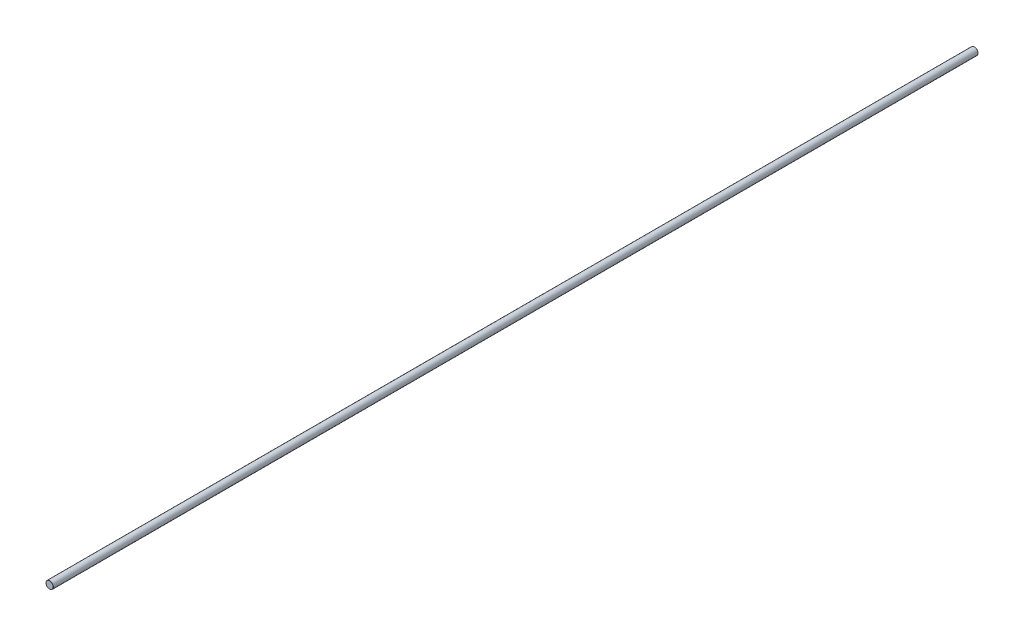
ISO-10303-21;
HEADER;
FILE_DESCRIPTION(('STEP AP214'),'2;1');
FILE_NAME('part.step','',(''),(''),'','','');
FILE_SCHEMA(('AUTOMOTIVE_DESIGN { 1 0 10303 214 1 1 1 1 }'));
ENDSEC;
DATA;
#1=APPLICATION_CONTEXT('core data for automotive mechanical design processes');
#2=APPLICATION_PROTOCOL_DEFINITION('international standard','automotive_design',2000,#1);
#3=PRODUCT_CONTEXT('',#1,'mechanical');
#4=PRODUCT('Part','Part','',(#3));
#5=PRODUCT_RELATED_PRODUCT_CATEGORY('part','',(#4));
#6=PRODUCT_DEFINITION_FORMATION('','',#4);
#7=PRODUCT_DEFINITION_CONTEXT('part definition',#1,'design');
#8=PRODUCT_DEFINITION('design','',#6,#7);
#9=PRODUCT_DEFINITION_SHAPE('','',#8);
#10=(LENGTH_UNIT() NAMED_UNIT(*) SI_UNIT(.MILLI.,.METRE.));
#11=(NAMED_UNIT(*) PLANE_ANGLE_UNIT() SI_UNIT($,.RADIAN.));
#12=(NAMED_UNIT(*) SI_UNIT($,.STERADIAN.) SOLID_ANGLE_UNIT());
#13=UNCERTAINTY_MEASURE_WITH_UNIT(LENGTH_MEASURE(1.E-05),#10,'distance_accuracy_value','');
#14=(GEOMETRIC_REPRESENTATION_CONTEXT(3) GLOBAL_UNCERTAINTY_ASSIGNED_CONTEXT((#13)) GLOBAL_UNIT_ASSIGNED_CONTEXT((#10,
#11,#12)) REPRESENTATION_CONTEXT('',''));
#15=CARTESIAN_POINT('',(0.,0.,0.));
#16=DIRECTION('',(0.,0.,1.));
#17=DIRECTION('',(1.,0.,0.));
#18=AXIS2_PLACEMENT_3D('',#15,#16,#17);
#19=CARTESIAN_POINT('',(0.,0.,750.));
#20=DIRECTION('',(0.,0.,-1.));
#21=DIRECTION('',(-1.,0.,0.));
#22=AXIS2_PLACEMENT_3D('',#19,#20,#21);
#23=CYLINDRICAL_SURFACE('',#22,6.);
#24=CARTESIAN_POINT('',(0.,-6.,0.0411462600315676));
#25=CARTESIAN_POINT('',(0.0023111743343624,-5.99999999809235,0.0411461575524475));
#26=CARTESIAN_POINT('',(0.00462402379593703,-5.9999986502803,0.0409508795649558));
#27=CARTESIAN_POINT('',(0.00918602363786496,-5.99999340315987,0.0401745878903154));
#28=CARTESIAN_POINT('',(0.0114350939780579,-5.99998950078168,0.039593110095375));
#29=CARTESIAN_POINT('',(0.015802783608805,-5.99997958659621,0.0380609747067094));
#30=CARTESIAN_POINT('',(0.0179214647265922,-5.99997357579789,0.037110493672024));
#31=CARTESIAN_POINT('',(0.0219685893059671,-5.99996012333506,0.0348675755401611));
#32=CARTESIAN_POINT('',(0.0238970798635291,-5.99995268202614,0.0335752233922364));
#33=CARTESIAN_POINT('',(0.0275099924272328,-5.999937205507,0.0306849647248258));
#34=CARTESIAN_POINT('',(0.0291943852810984,-5.99992917022602,0.0290870217617961));
#35=CARTESIAN_POINT('',(0.0322710559605854,-5.99991341205564,0.025630967888062));
#36=CARTESIAN_POINT('',(0.033663322306052,-5.99990568917853,0.0237728467575097));
#37=CARTESIAN_POINT('',(0.0361161286221365,-5.99989142694923,0.0198492472603494));
#38=CARTESIAN_POINT('',(0.0371766715052503,-5.99988488758665,0.0177837707145097));
#39=CARTESIAN_POINT('',(0.0389359363808815,-5.99987372960757,0.0135040828250582));
#40=CARTESIAN_POINT('',(0.0396346591387192,-5.99986911098701,0.0112898717960602));
#41=CARTESIAN_POINT('',(0.0406504429280133,-5.99986231527358,0.0067755992599893));
#42=CARTESIAN_POINT('',(0.040967509318674,-5.99986013814643,0.00447553895887625));
#43=CARTESIAN_POINT('',(0.0412109958074482,-5.99985847077535,-0.000145163273392342));
#44=CARTESIAN_POINT('',(0.041137416654171,-5.99985898052629,-0.00246580516509808));
#45=CARTESIAN_POINT('',(0.0406017073466908,-5.99986262939482,-0.00706175831748621));
#46=CARTESIAN_POINT('',(0.0401395835869672,-5.99986576846915,-0.00933707032355511));
#47=CARTESIAN_POINT('',(0.038839912623834,-5.99987432201555,-0.0137778174466584));
#48=CARTESIAN_POINT('',(0.0380023650015878,-5.99987973649015,-0.015943252441107));
#49=CARTESIAN_POINT('',(0.0359756145139185,-5.99989223044934,-0.0201027931831389));
#50=CARTESIAN_POINT('',(0.0347864087539367,-5.99989930994764,-0.0220968975202956));
#51=CARTESIAN_POINT('',(0.0320901026755382,-5.99991433578138,-0.0258571542101351));
#52=CARTESIAN_POINT('',(0.0305830024410953,-5.9999222821166,-0.0276233066230328));
#53=CARTESIAN_POINT('',(0.0272936520035431,-5.99993814594131,-0.0308775628460587));
#54=CARTESIAN_POINT('',(0.0255113960987836,-5.9999460634302,-0.0323656608930588));
#55=CARTESIAN_POINT('',(0.0217223471813882,-5.99996097677218,-0.03502152152381));
#56=CARTESIAN_POINT('',(0.0197155541391024,-5.99996797262514,-0.0361892840652609));
#57=CARTESIAN_POINT('',(0.0155343949997798,-5.99998025397507,-0.038171323409717));
#58=CARTESIAN_POINT('',(0.013360028829082,-5.99998553947128,-0.0389856000573371));
#59=CARTESIAN_POINT('',(0.00890544864594184,-5.999993804199,-0.0402375491551924));
#60=CARTESIAN_POINT('',(0.00662523465306968,-5.99999678343094,-0.0406752216750574));
#61=CARTESIAN_POINT('',(0.00202373701584674,-6.00000009970571,-0.0411615313605683));
#62=CARTESIAN_POINT('',(-0.000297545790773578,-6.00000043680238,-0.0412101764525306));
#63=CARTESIAN_POINT('',(-0.00491533055459514,-5.99999843094424,-0.0409170710269107));
#64=CARTESIAN_POINT('',(-0.00721183251223688,-5.99999608798948,-0.0405753205162679));
#65=CARTESIAN_POINT('',(-0.0117148426745234,-5.99998898620817,-0.0395111316758278));
#66=CARTESIAN_POINT('',(-0.0139213517235587,-5.9999842274043,-0.0387886969188219));
#67=CARTESIAN_POINT('',(-0.0181817654704784,-5.99997283043002,-0.0369836511031804));
#68=CARTESIAN_POINT('',(-0.02023567017117,-5.99996619225964,-0.0359010400511703));
#69=CARTESIAN_POINT('',(-0.0241326075719741,-5.99995178479046,-0.0334063534104953));
#70=CARTESIAN_POINT('',(-0.0259756368769588,-5.99994401547345,-0.0319942725184251));
#71=CARTESIAN_POINT('',(-0.0293984720078002,-5.99992822168261,-0.0288807381473676));
#72=CARTESIAN_POINT('',(-0.0309782776976255,-5.99992019720866,-0.0271792845188361));
#73=CARTESIAN_POINT('',(-0.0338298455435246,-5.99990479764699,-0.0235352698053704));
#74=CARTESIAN_POINT('',(-0.0351016024986819,-5.99989742257024,-0.0215927046504861));
#75=CARTESIAN_POINT('',(-0.0373009348163904,-5.99988415346674,-0.0175216334965552));
#76=CARTESIAN_POINT('',(-0.0382285105638952,-5.99987825943833,-0.0153931277054795));
#77=CARTESIAN_POINT('',(-0.0397131419380418,-5.9998686170089,-0.0110106156580907));
#78=CARTESIAN_POINT('',(-0.0402702010248558,-5.99986486858785,-0.00875661057400056));
#79=CARTESIAN_POINT('',(-0.040997997894719,-5.99985993991725,-0.00418706366131385));
#80=CARTESIAN_POINT('',(-0.0411687350356596,-5.99985875967196,-0.00187152173044291));
#81=CARTESIAN_POINT('',(-0.0411190391443198,-5.99985910043711,0.00275530838387331));
#82=CARTESIAN_POINT('',(-0.0408986148736802,-5.99986062138703,0.00506659666143552));
#83=CARTESIAN_POINT('',(-0.0400728700875081,-5.99986619294629,0.00961936539494872));
#84=CARTESIAN_POINT('',(-0.0394675487984714,-5.99987024356072,0.0118608457106014));
#85=CARTESIAN_POINT('',(-0.037889181085029,-5.99988041786311,0.01621040648939));
#86=CARTESIAN_POINT('',(-0.0369161278268581,-5.99988654158959,0.0183184844725872));
#87=CARTESIAN_POINT('',(-0.0346299600822555,-5.99990017140304,0.0223412765111915));
#88=CARTESIAN_POINT('',(-0.0333168588932307,-5.99990767743596,0.0242559981236357));
#89=CARTESIAN_POINT('',(-0.0303879946884048,-5.99992322519059,0.0278376722065746));
#90=CARTESIAN_POINT('',(-0.0287722571384401,-5.9999312668672,0.0295046455031089));
#91=CARTESIAN_POINT('',(-0.0252833846294518,-5.99994698199807,0.0325440970409336));
#92=CARTESIAN_POINT('',(-0.0234101858069446,-5.99995465536034,0.0339165019972599));
#93=CARTESIAN_POINT('',(-0.0194592171728474,-5.99996876999062,0.0363278796294935));
#94=CARTESIAN_POINT('',(-0.0173813483071559,-5.99997521065756,0.0373666898092503));
#95=CARTESIAN_POINT('',(-0.0130823250826006,-5.99998612114058,0.0390795232007372));
#96=CARTESIAN_POINT('',(-0.0108613460448509,-5.9999905933175,0.0397539836050221));
#97=CARTESIAN_POINT('',(-0.00718851589022588,-5.9999958610927,0.0405392666301184));
#98=CARTESIAN_POINT('',(-0.00576052870439959,-5.99999740649432,0.040766604956749));
#99=CARTESIAN_POINT('',(-0.00288857916786913,-5.99999947654416,0.0410701336840068));
#100=CARTESIAN_POINT('',(-0.00144461681740541,-6.00000000119239,0.0411463240869087));
#101=CARTESIAN_POINT('',(0.,-6.,0.0411462600315676));
#102=B_SPLINE_CURVE_WITH_KNOTS('',3,(#24,#25,#26,#27,#28,#29,#30,#31,#32,#33,#34,#35,#36,#37,
#38,#39,#40,#41,#42,#43,#44,#45,#46,#47,#48,#49,#50,#51,#52,#53,#54,#55,#56,#57,#58,#59,#60,#61,
#62,#63,#64,#65,#66,#67,#68,#69,#70,#71,#72,#73,#74,#75,#76,#77,#78,#79,#80,#81,#82,#83,#84,#85,
#86,#87,#88,#89,#90,#91,#92,#93,#94,#95,#96,#97,#98,#99,#100,#101),.UNSPECIFIED.,.T.,.F.,(4,2,2,
2,2,2,2,2,2,2,2,2,2,2,2,2,2,2,2,2,2,2,2,2,2,2,2,2,2,2,2,2,2,2,2,2,2,2,4),(0.,
0.00692825014559416,0.0138648412765288,0.0207981175004048,0.0277296725367568,0.0346620547188292,
0.041594709282622,0.0485273029767534,0.0554598820070322,0.0623923636891624,0.0693248320863132,
0.0762571863944823,0.0831895484366588,0.0901219675418917,0.0970543848158841,0.103986945759549,
0.110919507618657,0.117852072525172,0.124784636149932,0.131717058525439,0.138649480777719,
0.145581837969104,0.152514195032964,0.159446663693189,0.166379135936037,0.17331172521458,
0.180244306739261,0.187176823521204,0.194109351825727,0.20104172485022,0.207974111806325,
0.214906627597121,0.221838872336224,0.22877053401199,0.235703918205763,0.242640674590477,
0.249569088791317,0.253899643469665,0.258230198082837),.UNSPECIFIED.);
#103=CARTESIAN_POINT('',(0.,-6.,0.0411462600315676));
#104=VERTEX_POINT('',#103);
#105=EDGE_CURVE('E11',#104,#104,#102,.T.);
#106=ORIENTED_EDGE('',*,*,#105,.T.);
#107=EDGE_LOOP('',(#106));
#108=FACE_BOUND('',#107,.T.);
#109=CARTESIAN_POINT('',(0.,0.,-749.76));
#110=DIRECTION('',(0.,0.,1.));
#111=DIRECTION('',(1.,0.,0.));
#112=AXIS2_PLACEMENT_3D('',#109,#110,#111);
#113=CIRCLE('',#112,6.);
#114=CARTESIAN_POINT('',(6.,0.,-749.76));
#115=VERTEX_POINT('',#114);
#116=EDGE_CURVE('E74',#115,#115,#113,.T.);
#117=ORIENTED_EDGE('',*,*,#116,.T.);
#118=EDGE_LOOP('',(#117));
#119=FACE_BOUND('',#118,.T.);
#120=CARTESIAN_POINT('',(0.,0.,749.76));
#121=DIRECTION('',(0.,0.,1.));
#122=DIRECTION('',(1.,0.,0.));
#123=AXIS2_PLACEMENT_3D('',#120,#121,#122);
#124=CIRCLE('',#123,6.);
#125=CARTESIAN_POINT('',(6.,0.,749.76));
#126=VERTEX_POINT('',#125);
#127=EDGE_CURVE('E83',#126,#126,#124,.F.);
#128=ORIENTED_EDGE('',*,*,#127,.T.);
#129=EDGE_LOOP('',(#128));
#130=FACE_BOUND('',#129,.T.);
#131=ADVANCED_FACE('F50',(#108,#119,#130),#23,.T.);
#132=CARTESIAN_POINT('',(0.,0.,750.));
#133=DIRECTION('',(0.,0.,1.));
#134=DIRECTION('',(1.,0.,0.));
#135=AXIS2_PLACEMENT_3D('',#132,#133,#134);
#136=PLANE('',#135);
#137=CARTESIAN_POINT('',(0.,0.,750.));
#138=DIRECTION('',(0.,0.,1.));
#139=DIRECTION('',(1.,0.,0.));
#140=AXIS2_PLACEMENT_3D('',#137,#138,#139);
#141=CIRCLE('',#140,5.76000000000021);
#142=CARTESIAN_POINT('',(5.76000000000021,0.,750.));
#143=VERTEX_POINT('',#142);
#144=EDGE_CURVE('E64',#143,#143,#141,.T.);
#145=ORIENTED_EDGE('',*,*,#144,.T.);
#146=EDGE_LOOP('',(#145));
#147=FACE_BOUND('',#146,.T.);
#148=ADVANCED_FACE('F103',(#147),#136,.T.);
#149=CARTESIAN_POINT('',(0.,0.,-750.));
#150=DIRECTION('',(0.,0.,1.));
#151=DIRECTION('',(1.,0.,0.));
#152=AXIS2_PLACEMENT_3D('',#149,#150,#151);
#153=PLANE('',#152);
#154=CARTESIAN_POINT('',(0.,0.,-750.));
#155=DIRECTION('',(0.,0.,1.));
#156=DIRECTION('',(1.,0.,0.));
#157=AXIS2_PLACEMENT_3D('',#154,#155,#156);
#158=CIRCLE('',#157,5.75999999999977);
#159=CARTESIAN_POINT('',(5.75999999999977,0.,-750.));
#160=VERTEX_POINT('',#159);
#161=EDGE_CURVE('E69',#160,#160,#158,.F.);
#162=ORIENTED_EDGE('',*,*,#161,.T.);
#163=EDGE_LOOP('',(#162));
#164=FACE_BOUND('',#163,.T.);
#165=ADVANCED_FACE('F108',(#164),#153,.F.);
#166=CARTESIAN_POINT('',(0.,0.,-749.76));
#167=DIRECTION('',(0.,0.,1.));
#168=DIRECTION('',(1.,0.,0.));
#169=AXIS2_PLACEMENT_3D('',#166,#167,#168);
#170=CONICAL_SURFACE('',#169,6.,0.785398163397439);
#171=ORIENTED_EDGE('',*,*,#161,.F.);
#172=EDGE_LOOP('',(#171));
#173=FACE_BOUND('',#172,.T.);
#174=ORIENTED_EDGE('',*,*,#116,.F.);
#175=EDGE_LOOP('',(#174));
#176=FACE_BOUND('',#175,.T.);
#177=ADVANCED_FACE('F113',(#173,#176),#170,.T.);
#178=CARTESIAN_POINT('',(0.,0.,750.));
#179=DIRECTION('',(0.,0.,-1.));
#180=DIRECTION('',(-1.,0.,0.));
#181=AXIS2_PLACEMENT_3D('',#178,#179,#180);
#182=CONICAL_SURFACE('',#181,5.76000000000021,0.785398163397439);
#183=ORIENTED_EDGE('',*,*,#127,.F.);
#184=EDGE_LOOP('',(#183));
#185=FACE_BOUND('',#184,.T.);
#186=ORIENTED_EDGE('',*,*,#144,.F.);
#187=EDGE_LOOP('',(#186));
#188=FACE_BOUND('',#187,.T.);
#189=ADVANCED_FACE('F52',(#185,#188),#182,.T.);
#190=CARTESIAN_POINT('',(0.,-6.,0.));
#191=DIRECTION('',(0.,1.,0.));
#192=DIRECTION('',(0.,0.,1.));
#193=AXIS2_PLACEMENT_3D('',#190,#191,#192);
#194=CYLINDRICAL_SURFACE('',#193,0.0411462600315676);
#195=CARTESIAN_POINT('',(0.,0.,0.));
#196=DIRECTION('',(0.,1.,0.));
#197=DIRECTION('',(0.,0.,1.));
#198=AXIS2_PLACEMENT_3D('',#195,#196,#197);
#199=CIRCLE('',#198,0.0411462600315676);
#200=CARTESIAN_POINT('',(0.,0.,0.0411462600315676));
#201=VERTEX_POINT('',#200);
#202=EDGE_CURVE('E87',#201,#201,#199,.T.);
#203=ORIENTED_EDGE('',*,*,#202,.T.);
#204=EDGE_LOOP('',(#203));
#205=FACE_BOUND('',#204,.T.);
#206=ORIENTED_EDGE('',*,*,#105,.F.);
#207=EDGE_LOOP('',(#206));
#208=FACE_BOUND('',#207,.T.);
#209=ADVANCED_FACE('F92',(#205,#208),#194,.F.);
#210=CARTESIAN_POINT('',(0.,0.,0.));
#211=DIRECTION('',(0.,1.,0.));
#212=DIRECTION('',(0.,0.,1.));
#213=AXIS2_PLACEMENT_3D('',#210,#211,#212);
#214=PLANE('',#213);
#215=ORIENTED_EDGE('',*,*,#202,.F.);
#216=EDGE_LOOP('',(#215));
#217=FACE_BOUND('',#216,.T.);
#218=ADVANCED_FACE('F95',(#217),#214,.F.);
#219=CLOSED_SHELL('',(#131,#148,#165,#177,#189,#209,#218));
#220=MANIFOLD_SOLID_BREP('B2',#219);
#221=ADVANCED_BREP_SHAPE_REPRESENTATION('',(#18,#220),#14);
#222=SHAPE_DEFINITION_REPRESENTATION(#9,#221);
ENDSEC;
END-ISO-10303-21;
